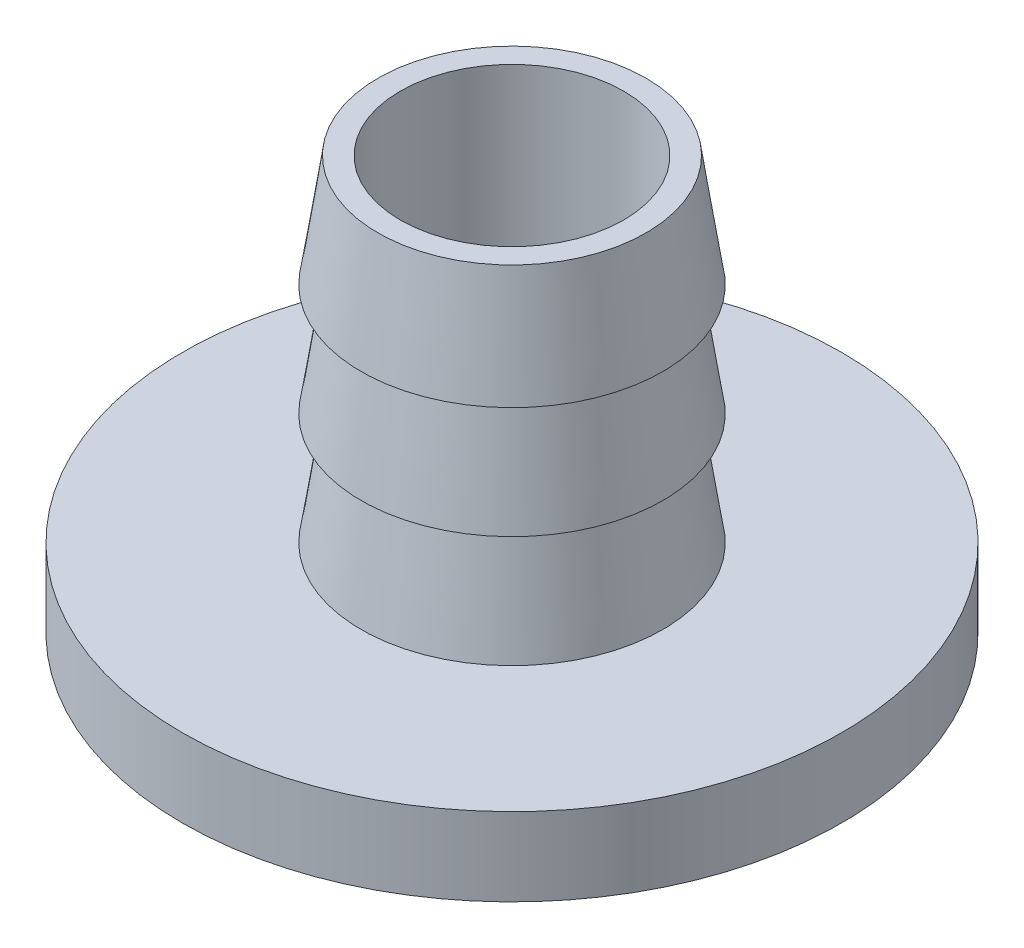
ISO-10303-21;
HEADER;
FILE_DESCRIPTION(('STEP AP214'),'2;1');
FILE_NAME('part.step','',(''),(''),'','','');
FILE_SCHEMA(('AUTOMOTIVE_DESIGN { 1 0 10303 214 1 1 1 1 }'));
ENDSEC;
DATA;
#1=APPLICATION_CONTEXT('core data for automotive mechanical design processes');
#2=APPLICATION_PROTOCOL_DEFINITION('international standard','automotive_design',2000,#1);
#3=PRODUCT_CONTEXT('',#1,'mechanical');
#4=PRODUCT('Part','Part','',(#3));
#5=PRODUCT_RELATED_PRODUCT_CATEGORY('part','',(#4));
#6=PRODUCT_DEFINITION_FORMATION('','',#4);
#7=PRODUCT_DEFINITION_CONTEXT('part definition',#1,'design');
#8=PRODUCT_DEFINITION('design','',#6,#7);
#9=PRODUCT_DEFINITION_SHAPE('','',#8);
#10=(LENGTH_UNIT() NAMED_UNIT(*) SI_UNIT(.MILLI.,.METRE.));
#11=(NAMED_UNIT(*) PLANE_ANGLE_UNIT() SI_UNIT($,.RADIAN.));
#12=(NAMED_UNIT(*) SI_UNIT($,.STERADIAN.) SOLID_ANGLE_UNIT());
#13=UNCERTAINTY_MEASURE_WITH_UNIT(LENGTH_MEASURE(1.E-05),#10,'distance_accuracy_value','');
#14=(GEOMETRIC_REPRESENTATION_CONTEXT(3) GLOBAL_UNCERTAINTY_ASSIGNED_CONTEXT((#13)) GLOBAL_UNIT_ASSIGNED_CONTEXT((#10,
#11,#12)) REPRESENTATION_CONTEXT('',''));
#15=CARTESIAN_POINT('',(0.,0.,0.));
#16=DIRECTION('',(0.,0.,1.));
#17=DIRECTION('',(1.,0.,0.));
#18=AXIS2_PLACEMENT_3D('',#15,#16,#17);
#19=CARTESIAN_POINT('',(12.,32.,0.));
#20=DIRECTION('',(0.,1.,0.));
#21=DIRECTION('',(0.,0.,1.));
#22=AXIS2_PLACEMENT_3D('',#19,#20,#21);
#23=PLANE('',#22);
#24=CARTESIAN_POINT('',(0.,32.,0.));
#25=DIRECTION('',(0.,-1.,0.));
#26=DIRECTION('',(0.,0.,-1.));
#27=AXIS2_PLACEMENT_3D('',#24,#25,#26);
#28=CIRCLE('',#27,10.);
#29=CARTESIAN_POINT('',(0.,32.,-10.));
#30=VERTEX_POINT('',#29);
#31=EDGE_CURVE('E10',#30,#30,#28,.T.);
#32=ORIENTED_EDGE('',*,*,#31,.T.);
#33=EDGE_LOOP('',(#32));
#34=FACE_BOUND('',#33,.T.);
#35=CARTESIAN_POINT('',(0.,32.,0.));
#36=DIRECTION('',(0.,-1.,0.));
#37=DIRECTION('',(0.,0.,-1.));
#38=AXIS2_PLACEMENT_3D('',#35,#36,#37);
#39=CIRCLE('',#38,12.);
#40=CARTESIAN_POINT('',(0.,32.,-12.));
#41=VERTEX_POINT('',#40);
#42=EDGE_CURVE('E71',#41,#41,#39,.T.);
#43=ORIENTED_EDGE('',*,*,#42,.F.);
#44=EDGE_LOOP('',(#43));
#45=FACE_BOUND('',#44,.T.);
#46=ADVANCED_FACE('F31',(#34,#45),#23,.T.);
#47=CARTESIAN_POINT('',(0.,0.,0.));
#48=DIRECTION('',(0.,-1.,0.));
#49=DIRECTION('',(0.,0.,-1.));
#50=AXIS2_PLACEMENT_3D('',#47,#48,#49);
#51=CYLINDRICAL_SURFACE('',#50,10.);
#52=CARTESIAN_POINT('',(0.,0.,0.));
#53=DIRECTION('',(0.,-1.,0.));
#54=DIRECTION('',(0.,0.,-1.));
#55=AXIS2_PLACEMENT_3D('',#52,#53,#54);
#56=CIRCLE('',#55,10.);
#57=CARTESIAN_POINT('',(0.,0.,-10.));
#58=VERTEX_POINT('',#57);
#59=EDGE_CURVE('E37',#58,#58,#56,.T.);
#60=ORIENTED_EDGE('',*,*,#59,.T.);
#61=EDGE_LOOP('',(#60));
#62=FACE_BOUND('',#61,.T.);
#63=ORIENTED_EDGE('',*,*,#31,.F.);
#64=EDGE_LOOP('',(#63));
#65=FACE_BOUND('',#64,.T.);
#66=ADVANCED_FACE('F79',(#62,#65),#51,.F.);
#67=CARTESIAN_POINT('',(10.,0.,0.));
#68=DIRECTION('',(0.,-1.,0.));
#69=DIRECTION('',(0.,0.,-1.));
#70=AXIS2_PLACEMENT_3D('',#67,#68,#69);
#71=PLANE('',#70);
#72=CARTESIAN_POINT('',(0.,0.,0.));
#73=DIRECTION('',(0.,-1.,0.));
#74=DIRECTION('',(0.,0.,-1.));
#75=AXIS2_PLACEMENT_3D('',#72,#73,#74);
#76=CIRCLE('',#75,28.5);
#77=CARTESIAN_POINT('',(0.,0.,-28.5));
#78=VERTEX_POINT('',#77);
#79=EDGE_CURVE('E41',#78,#78,#76,.T.);
#80=ORIENTED_EDGE('',*,*,#79,.T.);
#81=EDGE_LOOP('',(#80));
#82=FACE_BOUND('',#81,.T.);
#83=ORIENTED_EDGE('',*,*,#59,.F.);
#84=EDGE_LOOP('',(#83));
#85=FACE_BOUND('',#84,.T.);
#86=ADVANCED_FACE('F83',(#82,#85),#71,.T.);
#87=CARTESIAN_POINT('',(0.,0.,0.));
#88=DIRECTION('',(0.,-1.,0.));
#89=DIRECTION('',(0.,0.,-1.));
#90=AXIS2_PLACEMENT_3D('',#87,#88,#89);
#91=CYLINDRICAL_SURFACE('',#90,28.5);
#92=CARTESIAN_POINT('',(0.,-5.,0.));
#93=DIRECTION('',(0.,-1.,0.));
#94=DIRECTION('',(0.,0.,-1.));
#95=AXIS2_PLACEMENT_3D('',#92,#93,#94);
#96=CIRCLE('',#95,28.5);
#97=CARTESIAN_POINT('',(0.,-5.,-28.5));
#98=VERTEX_POINT('',#97);
#99=EDGE_CURVE('E45',#98,#98,#96,.T.);
#100=ORIENTED_EDGE('',*,*,#99,.T.);
#101=EDGE_LOOP('',(#100));
#102=FACE_BOUND('',#101,.T.);
#103=ORIENTED_EDGE('',*,*,#79,.F.);
#104=EDGE_LOOP('',(#103));
#105=FACE_BOUND('',#104,.T.);
#106=ADVANCED_FACE('F87',(#102,#105),#91,.F.);
#107=CARTESIAN_POINT('',(28.5,-5.,0.));
#108=DIRECTION('',(0.,-1.,0.));
#109=DIRECTION('',(0.,0.,-1.));
#110=AXIS2_PLACEMENT_3D('',#107,#108,#109);
#111=PLANE('',#110);
#112=CARTESIAN_POINT('',(0.,-5.,0.));
#113=DIRECTION('',(0.,-1.,0.));
#114=DIRECTION('',(0.,0.,-1.));
#115=AXIS2_PLACEMENT_3D('',#112,#113,#114);
#116=CIRCLE('',#115,29.5);
#117=CARTESIAN_POINT('',(0.,-5.,-29.5));
#118=VERTEX_POINT('',#117);
#119=EDGE_CURVE('E50',#118,#118,#116,.T.);
#120=ORIENTED_EDGE('',*,*,#119,.T.);
#121=EDGE_LOOP('',(#120));
#122=FACE_BOUND('',#121,.T.);
#123=ORIENTED_EDGE('',*,*,#99,.F.);
#124=EDGE_LOOP('',(#123));
#125=FACE_BOUND('',#124,.T.);
#126=ADVANCED_FACE('F94',(#122,#125),#111,.T.);
#127=CARTESIAN_POINT('',(0.,0.,0.));
#128=DIRECTION('',(0.,-1.,0.));
#129=DIRECTION('',(0.,0.,-1.));
#130=AXIS2_PLACEMENT_3D('',#127,#128,#129);
#131=CYLINDRICAL_SURFACE('',#130,29.5);
#132=CARTESIAN_POINT('',(0.,2.,0.));
#133=DIRECTION('',(0.,-1.,0.));
#134=DIRECTION('',(0.,0.,-1.));
#135=AXIS2_PLACEMENT_3D('',#132,#133,#134);
#136=CIRCLE('',#135,29.5);
#137=CARTESIAN_POINT('',(0.,2.,-29.5));
#138=VERTEX_POINT('',#137);
#139=EDGE_CURVE('E53',#138,#138,#136,.T.);
#140=ORIENTED_EDGE('',*,*,#139,.T.);
#141=EDGE_LOOP('',(#140));
#142=FACE_BOUND('',#141,.T.);
#143=ORIENTED_EDGE('',*,*,#119,.F.);
#144=EDGE_LOOP('',(#143));
#145=FACE_BOUND('',#144,.T.);
#146=ADVANCED_FACE('F98',(#142,#145),#131,.T.);
#147=CARTESIAN_POINT('',(29.5,2.,0.));
#148=DIRECTION('',(0.,1.,0.));
#149=DIRECTION('',(0.,0.,1.));
#150=AXIS2_PLACEMENT_3D('',#147,#148,#149);
#151=PLANE('',#150);
#152=CARTESIAN_POINT('',(0.,2.,0.));
#153=DIRECTION('',(0.,-1.,0.));
#154=DIRECTION('',(0.,0.,-1.));
#155=AXIS2_PLACEMENT_3D('',#152,#153,#154);
#156=CIRCLE('',#155,13.5);
#157=CARTESIAN_POINT('',(0.,2.,-13.5));
#158=VERTEX_POINT('',#157);
#159=EDGE_CURVE('E56',#158,#158,#156,.T.);
#160=ORIENTED_EDGE('',*,*,#159,.T.);
#161=EDGE_LOOP('',(#160));
#162=FACE_BOUND('',#161,.T.);
#163=ORIENTED_EDGE('',*,*,#139,.F.);
#164=EDGE_LOOP('',(#163));
#165=FACE_BOUND('',#164,.T.);
#166=ADVANCED_FACE('F102',(#162,#165),#151,.T.);
#167=CARTESIAN_POINT('',(0.,2.,0.));
#168=DIRECTION('',(0.,-1.,0.));
#169=DIRECTION('',(0.,0.,-1.));
#170=AXIS2_PLACEMENT_3D('',#167,#168,#169);
#171=CONICAL_SURFACE('',#170,13.5,0.148889947609498);
#172=CARTESIAN_POINT('',(0.,12.,0.));
#173=DIRECTION('',(0.,-1.,0.));
#174=DIRECTION('',(0.,0.,-1.));
#175=AXIS2_PLACEMENT_3D('',#172,#173,#174);
#176=CIRCLE('',#175,12.);
#177=CARTESIAN_POINT('',(0.,12.,-12.));
#178=VERTEX_POINT('',#177);
#179=EDGE_CURVE('E59',#178,#178,#176,.T.);
#180=ORIENTED_EDGE('',*,*,#179,.T.);
#181=EDGE_LOOP('',(#180));
#182=FACE_BOUND('',#181,.T.);
#183=ORIENTED_EDGE('',*,*,#159,.F.);
#184=EDGE_LOOP('',(#183));
#185=FACE_BOUND('',#184,.T.);
#186=ADVANCED_FACE('F106',(#182,#185),#171,.T.);
#187=CARTESIAN_POINT('',(12.,12.,0.));
#188=DIRECTION('',(0.,-1.,0.));
#189=DIRECTION('',(0.,0.,-1.));
#190=AXIS2_PLACEMENT_3D('',#187,#188,#189);
#191=PLANE('',#190);
#192=CARTESIAN_POINT('',(0.,12.,0.));
#193=DIRECTION('',(0.,-1.,0.));
#194=DIRECTION('',(0.,0.,-1.));
#195=AXIS2_PLACEMENT_3D('',#192,#193,#194);
#196=CIRCLE('',#195,13.5);
#197=CARTESIAN_POINT('',(0.,12.,-13.5));
#198=VERTEX_POINT('',#197);
#199=EDGE_CURVE('E62',#198,#198,#196,.T.);
#200=ORIENTED_EDGE('',*,*,#199,.T.);
#201=EDGE_LOOP('',(#200));
#202=FACE_BOUND('',#201,.T.);
#203=ORIENTED_EDGE('',*,*,#179,.F.);
#204=EDGE_LOOP('',(#203));
#205=FACE_BOUND('',#204,.T.);
#206=ADVANCED_FACE('F110',(#202,#205),#191,.T.);
#207=CARTESIAN_POINT('',(0.,12.,0.));
#208=DIRECTION('',(0.,-1.,0.));
#209=DIRECTION('',(0.,0.,-1.));
#210=AXIS2_PLACEMENT_3D('',#207,#208,#209);
#211=CONICAL_SURFACE('',#210,13.5,0.148889947609498);
#212=CARTESIAN_POINT('',(0.,22.,0.));
#213=DIRECTION('',(0.,-1.,0.));
#214=DIRECTION('',(0.,0.,-1.));
#215=AXIS2_PLACEMENT_3D('',#212,#213,#214);
#216=CIRCLE('',#215,12.);
#217=CARTESIAN_POINT('',(0.,22.,-12.));
#218=VERTEX_POINT('',#217);
#219=EDGE_CURVE('E65',#218,#218,#216,.T.);
#220=ORIENTED_EDGE('',*,*,#219,.T.);
#221=EDGE_LOOP('',(#220));
#222=FACE_BOUND('',#221,.T.);
#223=ORIENTED_EDGE('',*,*,#199,.F.);
#224=EDGE_LOOP('',(#223));
#225=FACE_BOUND('',#224,.T.);
#226=ADVANCED_FACE('F114',(#222,#225),#211,.T.);
#227=CARTESIAN_POINT('',(12.,22.,0.));
#228=DIRECTION('',(0.,-1.,0.));
#229=DIRECTION('',(0.,0.,-1.));
#230=AXIS2_PLACEMENT_3D('',#227,#228,#229);
#231=PLANE('',#230);
#232=CARTESIAN_POINT('',(0.,22.,0.));
#233=DIRECTION('',(0.,-1.,0.));
#234=DIRECTION('',(0.,0.,-1.));
#235=AXIS2_PLACEMENT_3D('',#232,#233,#234);
#236=CIRCLE('',#235,13.5);
#237=CARTESIAN_POINT('',(0.,22.,-13.5));
#238=VERTEX_POINT('',#237);
#239=EDGE_CURVE('E68',#238,#238,#236,.T.);
#240=ORIENTED_EDGE('',*,*,#239,.T.);
#241=EDGE_LOOP('',(#240));
#242=FACE_BOUND('',#241,.T.);
#243=ORIENTED_EDGE('',*,*,#219,.F.);
#244=EDGE_LOOP('',(#243));
#245=FACE_BOUND('',#244,.T.);
#246=ADVANCED_FACE('F118',(#242,#245),#231,.T.);
#247=CARTESIAN_POINT('',(0.,22.,0.));
#248=DIRECTION('',(0.,-1.,0.));
#249=DIRECTION('',(0.,0.,-1.));
#250=AXIS2_PLACEMENT_3D('',#247,#248,#249);
#251=CONICAL_SURFACE('',#250,13.5,0.148889947609498);
#252=ORIENTED_EDGE('',*,*,#42,.T.);
#253=EDGE_LOOP('',(#252));
#254=FACE_BOUND('',#253,.T.);
#255=ORIENTED_EDGE('',*,*,#239,.F.);
#256=EDGE_LOOP('',(#255));
#257=FACE_BOUND('',#256,.T.);
#258=ADVANCED_FACE('F75',(#254,#257),#251,.T.);
#259=CLOSED_SHELL('',(#46,#66,#86,#106,#126,#146,#166,#186,#206,#226,#246,#258));
#260=MANIFOLD_SOLID_BREP('B2',#259);
#261=ADVANCED_BREP_SHAPE_REPRESENTATION('',(#18,#260),#14);
#262=SHAPE_DEFINITION_REPRESENTATION(#9,#261);
ENDSEC;
END-ISO-10303-21;
